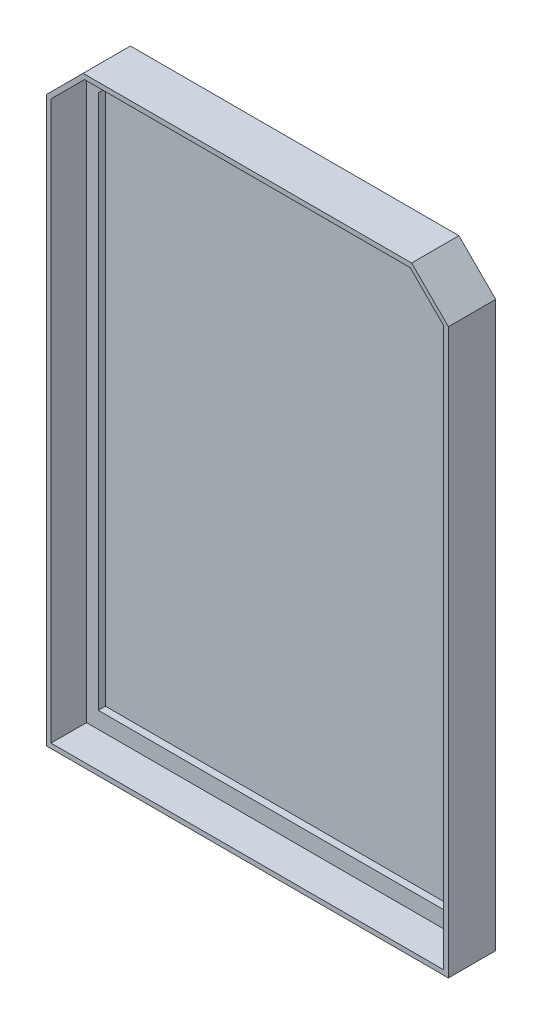
ISO-10303-21;
HEADER;
FILE_DESCRIPTION(('STEP AP214'),'2;1');
FILE_NAME('part.step','',(''),(''),'','','');
FILE_SCHEMA(('AUTOMOTIVE_DESIGN { 1 0 10303 214 1 1 1 1 }'));
ENDSEC;
DATA;
#1=APPLICATION_CONTEXT('core data for automotive mechanical design processes');
#2=APPLICATION_PROTOCOL_DEFINITION('international standard','automotive_design',2000,#1);
#3=PRODUCT_CONTEXT('',#1,'mechanical');
#4=PRODUCT('Part','Part','',(#3));
#5=PRODUCT_RELATED_PRODUCT_CATEGORY('part','',(#4));
#6=PRODUCT_DEFINITION_FORMATION('','',#4);
#7=PRODUCT_DEFINITION_CONTEXT('part definition',#1,'design');
#8=PRODUCT_DEFINITION('design','',#6,#7);
#9=PRODUCT_DEFINITION_SHAPE('','',#8);
#10=(LENGTH_UNIT() NAMED_UNIT(*) SI_UNIT(.MILLI.,.METRE.));
#11=(NAMED_UNIT(*) PLANE_ANGLE_UNIT() SI_UNIT($,.RADIAN.));
#12=(NAMED_UNIT(*) SI_UNIT($,.STERADIAN.) SOLID_ANGLE_UNIT());
#13=UNCERTAINTY_MEASURE_WITH_UNIT(LENGTH_MEASURE(1.E-05),#10,'distance_accuracy_value','');
#14=(GEOMETRIC_REPRESENTATION_CONTEXT(3) GLOBAL_UNCERTAINTY_ASSIGNED_CONTEXT((#13)) GLOBAL_UNIT_ASSIGNED_CONTEXT((#10,
#11,#12)) REPRESENTATION_CONTEXT('',''));
#15=CARTESIAN_POINT('',(0.,0.,0.));
#16=DIRECTION('',(0.,0.,1.));
#17=DIRECTION('',(1.,0.,0.));
#18=AXIS2_PLACEMENT_3D('',#15,#16,#17);
#19=CARTESIAN_POINT('',(46.5251262658473,46.5251262658468,1.5));
#20=DIRECTION('',(0.707106781186551,0.707106781186544,0.));
#21=DIRECTION('',(-0.707106781186544,0.707106781186551,0.));
#22=AXIS2_PLACEMENT_3D('',#19,#20,#21);
#23=PLANE('',#22);
#24=DIRECTION('',(0.707106781186544,-0.707106781186551,0.));
#25=VECTOR('',#24,1.);
#26=CARTESIAN_POINT('',(46.5251262658473,46.5251262658468,0.));
#27=LINE('',#26,#25);
#28=CARTESIAN_POINT('',(34.0502525316942,59.,0.));
#29=VERTEX_POINT('',#28);
#30=CARTESIAN_POINT('',(39.,54.0502525316942,0.));
#31=VERTEX_POINT('',#30);
#32=EDGE_CURVE('E171',#29,#31,#27,.T.);
#33=ORIENTED_EDGE('',*,*,#32,.T.);
#34=DIRECTION('',(0.,0.,-1.));
#35=VECTOR('',#34,1.);
#36=CARTESIAN_POINT('',(39.,54.0502525316942,1.5));
#37=LINE('',#36,#35);
#38=CARTESIAN_POINT('',(39.,54.0502525316942,1.5));
#39=VERTEX_POINT('',#38);
#40=EDGE_CURVE('E318',#39,#31,#37,.T.);
#41=ORIENTED_EDGE('',*,*,#40,.F.);
#42=DIRECTION('',(0.707106781186544,-0.707106781186551,0.));
#43=VECTOR('',#42,1.);
#44=CARTESIAN_POINT('',(46.5251262658473,46.5251262658468,1.5));
#45=LINE('',#44,#43);
#46=CARTESIAN_POINT('',(34.0502525316942,59.,1.5));
#47=VERTEX_POINT('',#46);
#48=EDGE_CURVE('E259',#47,#39,#45,.T.);
#49=ORIENTED_EDGE('',*,*,#48,.F.);
#50=DIRECTION('',(0.,0.,-1.));
#51=VECTOR('',#50,1.);
#52=CARTESIAN_POINT('',(34.0502525316942,59.,1.5));
#53=LINE('',#52,#51);
#54=EDGE_CURVE('E288',#47,#29,#53,.T.);
#55=ORIENTED_EDGE('',*,*,#54,.T.);
#56=EDGE_LOOP('',(#33,#41,#49,#55));
#57=FACE_BOUND('',#56,.T.);
#58=ADVANCED_FACE('F41',(#57),#23,.F.);
#59=CARTESIAN_POINT('',(39.,0.,1.5));
#60=DIRECTION('',(1.,0.,0.));
#61=DIRECTION('',(0.,0.,-1.));
#62=AXIS2_PLACEMENT_3D('',#59,#60,#61);
#63=PLANE('',#62);
#64=DIRECTION('',(0.,-1.,0.));
#65=VECTOR('',#64,1.);
#66=CARTESIAN_POINT('',(39.,0.,0.));
#67=LINE('',#66,#65);
#68=CARTESIAN_POINT('',(39.,-59.,0.));
#69=VERTEX_POINT('',#68);
#70=EDGE_CURVE('E291',#31,#69,#67,.T.);
#71=ORIENTED_EDGE('',*,*,#70,.T.);
#72=DIRECTION('',(0.,0.,-1.));
#73=VECTOR('',#72,1.);
#74=CARTESIAN_POINT('',(39.,-59.,1.5));
#75=LINE('',#74,#73);
#76=CARTESIAN_POINT('',(39.,-59.,1.5));
#77=VERTEX_POINT('',#76);
#78=EDGE_CURVE('E315',#77,#69,#75,.T.);
#79=ORIENTED_EDGE('',*,*,#78,.F.);
#80=DIRECTION('',(0.,-1.,0.));
#81=VECTOR('',#80,1.);
#82=CARTESIAN_POINT('',(39.,0.,1.5));
#83=LINE('',#82,#81);
#84=EDGE_CURVE('E262',#39,#77,#83,.T.);
#85=ORIENTED_EDGE('',*,*,#84,.F.);
#86=ORIENTED_EDGE('',*,*,#40,.T.);
#87=EDGE_LOOP('',(#71,#79,#85,#86));
#88=FACE_BOUND('',#87,.T.);
#89=ADVANCED_FACE('F338',(#88),#63,.F.);
#90=CARTESIAN_POINT('',(0.,-59.,1.5));
#91=DIRECTION('',(0.,-1.,0.));
#92=DIRECTION('',(0.,0.,-1.));
#93=AXIS2_PLACEMENT_3D('',#90,#91,#92);
#94=PLANE('',#93);
#95=DIRECTION('',(-1.,0.,0.));
#96=VECTOR('',#95,1.);
#97=CARTESIAN_POINT('',(0.,-59.,0.));
#98=LINE('',#97,#96);
#99=CARTESIAN_POINT('',(-39.,-59.,0.));
#100=VERTEX_POINT('',#99);
#101=EDGE_CURVE('E294',#69,#100,#98,.T.);
#102=ORIENTED_EDGE('',*,*,#101,.T.);
#103=DIRECTION('',(0.,0.,-1.));
#104=VECTOR('',#103,1.);
#105=CARTESIAN_POINT('',(-39.,-59.,1.5));
#106=LINE('',#105,#104);
#107=CARTESIAN_POINT('',(-39.,-59.,1.5));
#108=VERTEX_POINT('',#107);
#109=EDGE_CURVE('E312',#108,#100,#106,.T.);
#110=ORIENTED_EDGE('',*,*,#109,.F.);
#111=DIRECTION('',(-1.,0.,0.));
#112=VECTOR('',#111,1.);
#113=CARTESIAN_POINT('',(0.,-59.,1.5));
#114=LINE('',#113,#112);
#115=EDGE_CURVE('E265',#77,#108,#114,.T.);
#116=ORIENTED_EDGE('',*,*,#115,.F.);
#117=ORIENTED_EDGE('',*,*,#78,.T.);
#118=EDGE_LOOP('',(#102,#110,#116,#117));
#119=FACE_BOUND('',#118,.T.);
#120=ADVANCED_FACE('F344',(#119),#94,.F.);
#121=CARTESIAN_POINT('',(-39.,0.,1.5));
#122=DIRECTION('',(-1.,0.,0.));
#123=DIRECTION('',(0.,0.,1.));
#124=AXIS2_PLACEMENT_3D('',#121,#122,#123);
#125=PLANE('',#124);
#126=DIRECTION('',(0.,1.,0.));
#127=VECTOR('',#126,1.);
#128=CARTESIAN_POINT('',(-39.,0.,0.));
#129=LINE('',#128,#127);
#130=CARTESIAN_POINT('',(-39.,54.0502525316942,0.));
#131=VERTEX_POINT('',#130);
#132=EDGE_CURVE('E297',#100,#131,#129,.T.);
#133=ORIENTED_EDGE('',*,*,#132,.T.);
#134=DIRECTION('',(0.,0.,-1.));
#135=VECTOR('',#134,1.);
#136=CARTESIAN_POINT('',(-39.,54.0502525316942,1.5));
#137=LINE('',#136,#135);
#138=CARTESIAN_POINT('',(-39.,54.0502525316942,1.5));
#139=VERTEX_POINT('',#138);
#140=EDGE_CURVE('E309',#139,#131,#137,.T.);
#141=ORIENTED_EDGE('',*,*,#140,.F.);
#142=DIRECTION('',(0.,1.,0.));
#143=VECTOR('',#142,1.);
#144=CARTESIAN_POINT('',(-39.,0.,1.5));
#145=LINE('',#144,#143);
#146=EDGE_CURVE('E267',#108,#139,#145,.T.);
#147=ORIENTED_EDGE('',*,*,#146,.F.);
#148=ORIENTED_EDGE('',*,*,#109,.T.);
#149=EDGE_LOOP('',(#133,#141,#147,#148));
#150=FACE_BOUND('',#149,.T.);
#151=ADVANCED_FACE('F350',(#150),#125,.F.);
#152=CARTESIAN_POINT('',(-46.5251262658471,46.5251262658471,1.5));
#153=DIRECTION('',(-0.707106781186547,0.707106781186548,0.));
#154=DIRECTION('',(-0.707106781186548,-0.707106781186547,0.));
#155=AXIS2_PLACEMENT_3D('',#152,#153,#154);
#156=PLANE('',#155);
#157=DIRECTION('',(0.707106781186548,0.707106781186547,0.));
#158=VECTOR('',#157,1.);
#159=CARTESIAN_POINT('',(-46.5251262658471,46.5251262658471,0.));
#160=LINE('',#159,#158);
#161=CARTESIAN_POINT('',(-34.0502525316942,59.,0.));
#162=VERTEX_POINT('',#161);
#163=EDGE_CURVE('E300',#131,#162,#160,.T.);
#164=ORIENTED_EDGE('',*,*,#163,.T.);
#165=DIRECTION('',(0.,0.,-1.));
#166=VECTOR('',#165,1.);
#167=CARTESIAN_POINT('',(-34.0502525316942,59.,1.5));
#168=LINE('',#167,#166);
#169=CARTESIAN_POINT('',(-34.0502525316942,59.,1.5));
#170=VERTEX_POINT('',#169);
#171=EDGE_CURVE('E306',#170,#162,#168,.T.);
#172=ORIENTED_EDGE('',*,*,#171,.F.);
#173=DIRECTION('',(0.707106781186548,0.707106781186547,0.));
#174=VECTOR('',#173,1.);
#175=CARTESIAN_POINT('',(-46.5251262658471,46.5251262658471,1.5));
#176=LINE('',#175,#174);
#177=EDGE_CURVE('E269',#139,#170,#176,.T.);
#178=ORIENTED_EDGE('',*,*,#177,.F.);
#179=ORIENTED_EDGE('',*,*,#140,.T.);
#180=EDGE_LOOP('',(#164,#172,#178,#179));
#181=FACE_BOUND('',#180,.T.);
#182=ADVANCED_FACE('F354',(#181),#156,.F.);
#183=CARTESIAN_POINT('',(0.,59.,1.5));
#184=DIRECTION('',(0.,-1.,0.));
#185=DIRECTION('',(1.,0.,0.));
#186=AXIS2_PLACEMENT_3D('',#183,#184,#185);
#187=PLANE('',#186);
#188=DIRECTION('',(-1.,0.,0.));
#189=VECTOR('',#188,1.);
#190=CARTESIAN_POINT('',(0.,59.,0.));
#191=LINE('',#190,#189);
#192=EDGE_CURVE('E263',#29,#162,#191,.T.);
#193=ORIENTED_EDGE('',*,*,#192,.F.);
#194=ORIENTED_EDGE('',*,*,#54,.F.);
#195=DIRECTION('',(-1.,0.,0.));
#196=VECTOR('',#195,1.);
#197=CARTESIAN_POINT('',(0.,59.,1.5));
#198=LINE('',#197,#196);
#199=EDGE_CURVE('E271',#47,#170,#198,.T.);
#200=ORIENTED_EDGE('',*,*,#199,.T.);
#201=ORIENTED_EDGE('',*,*,#171,.T.);
#202=EDGE_LOOP('',(#193,#194,#200,#201));
#203=FACE_BOUND('',#202,.T.);
#204=ADVANCED_FACE('F358',(#203),#187,.T.);
#205=CARTESIAN_POINT('',(0.,0.,1.5));
#206=DIRECTION('',(0.,0.,1.));
#207=DIRECTION('',(1.,0.,0.));
#208=AXIS2_PLACEMENT_3D('',#205,#206,#207);
#209=PLANE('',#208);
#210=ORIENTED_EDGE('',*,*,#48,.T.);
#211=ORIENTED_EDGE('',*,*,#84,.T.);
#212=ORIENTED_EDGE('',*,*,#115,.T.);
#213=ORIENTED_EDGE('',*,*,#146,.T.);
#214=ORIENTED_EDGE('',*,*,#177,.T.);
#215=ORIENTED_EDGE('',*,*,#199,.F.);
#216=EDGE_LOOP('',(#210,#211,#212,#213,#214,#215));
#217=FACE_BOUND('',#216,.T.);
#218=DIRECTION('',(0.707106781186548,0.707106781186547,0.));
#219=VECTOR('',#218,1.);
#220=CARTESIAN_POINT('',(-48.4644660940673,48.4644660940673,1.5));
#221=LINE('',#220,#219);
#222=CARTESIAN_POINT('',(-41.5,55.4289321881345,1.5));
#223=VERTEX_POINT('',#222);
#224=CARTESIAN_POINT('',(-34.4289321881345,62.5,1.5));
#225=VERTEX_POINT('',#224);
#226=EDGE_CURVE('E274',#223,#225,#221,.T.);
#227=ORIENTED_EDGE('',*,*,#226,.F.);
#228=DIRECTION('',(0.,-1.,0.));
#229=VECTOR('',#228,1.);
#230=CARTESIAN_POINT('',(-41.5,0.,1.5));
#231=LINE('',#230,#229);
#232=CARTESIAN_POINT('',(-41.5,-62.5,1.5));
#233=VERTEX_POINT('',#232);
#234=EDGE_CURVE('E276',#223,#233,#231,.T.);
#235=ORIENTED_EDGE('',*,*,#234,.T.);
#236=DIRECTION('',(-1.,0.,0.));
#237=VECTOR('',#236,1.);
#238=CARTESIAN_POINT('',(0.,-62.5,1.5));
#239=LINE('',#238,#237);
#240=CARTESIAN_POINT('',(41.5,-62.5,1.5));
#241=VERTEX_POINT('',#240);
#242=EDGE_CURVE('E278',#241,#233,#239,.T.);
#243=ORIENTED_EDGE('',*,*,#242,.F.);
#244=DIRECTION('',(0.,-1.,0.));
#245=VECTOR('',#244,1.);
#246=CARTESIAN_POINT('',(41.5,0.,1.5));
#247=LINE('',#246,#245);
#248=CARTESIAN_POINT('',(41.5,55.4289321881345,1.5));
#249=VERTEX_POINT('',#248);
#250=EDGE_CURVE('E281',#249,#241,#247,.T.);
#251=ORIENTED_EDGE('',*,*,#250,.F.);
#252=DIRECTION('',(0.707106781186546,-0.707106781186549,0.));
#253=VECTOR('',#252,1.);
#254=CARTESIAN_POINT('',(48.4644660940673,48.4644660940672,1.5));
#255=LINE('',#254,#253);
#256=CARTESIAN_POINT('',(34.4289321881345,62.5,1.5));
#257=VERTEX_POINT('',#256);
#258=EDGE_CURVE('E284',#257,#249,#255,.T.);
#259=ORIENTED_EDGE('',*,*,#258,.F.);
#260=DIRECTION('',(-1.,0.,0.));
#261=VECTOR('',#260,1.);
#262=CARTESIAN_POINT('',(0.,62.5,1.5));
#263=LINE('',#262,#261);
#264=EDGE_CURVE('E57',#257,#225,#263,.T.);
#265=ORIENTED_EDGE('',*,*,#264,.T.);
#266=EDGE_LOOP('',(#227,#235,#243,#251,#259,#265));
#267=FACE_BOUND('',#266,.T.);
#268=ADVANCED_FACE('F362',(#217,#267),#209,.T.);
#269=CARTESIAN_POINT('',(0.,-63.5,9.));
#270=DIRECTION('',(0.,1.,0.));
#271=DIRECTION('',(0.,0.,1.));
#272=AXIS2_PLACEMENT_3D('',#269,#270,#271);
#273=PLANE('',#272);
#274=DIRECTION('',(0.,0.,-1.));
#275=VECTOR('',#274,1.);
#276=CARTESIAN_POINT('',(-42.5,-63.5,9.));
#277=LINE('',#276,#275);
#278=CARTESIAN_POINT('',(-42.5,-63.5,9.));
#279=VERTEX_POINT('',#278);
#280=CARTESIAN_POINT('',(-42.5,-63.5,-1.));
#281=VERTEX_POINT('',#280);
#282=EDGE_CURVE('E187',#279,#281,#277,.T.);
#283=ORIENTED_EDGE('',*,*,#282,.T.);
#284=DIRECTION('',(1.,0.,0.));
#285=VECTOR('',#284,1.);
#286=CARTESIAN_POINT('',(0.,-63.5,-1.));
#287=LINE('',#286,#285);
#288=CARTESIAN_POINT('',(42.5,-63.5,-1.));
#289=VERTEX_POINT('',#288);
#290=EDGE_CURVE('E179',#281,#289,#287,.T.);
#291=ORIENTED_EDGE('',*,*,#290,.T.);
#292=DIRECTION('',(0.,0.,-1.));
#293=VECTOR('',#292,1.);
#294=CARTESIAN_POINT('',(42.5,-63.5,9.));
#295=LINE('',#294,#293);
#296=CARTESIAN_POINT('',(42.5,-63.5,9.));
#297=VERTEX_POINT('',#296);
#298=EDGE_CURVE('E161',#297,#289,#295,.T.);
#299=ORIENTED_EDGE('',*,*,#298,.F.);
#300=DIRECTION('',(1.,0.,0.));
#301=VECTOR('',#300,1.);
#302=CARTESIAN_POINT('',(0.,-63.5,9.));
#303=LINE('',#302,#301);
#304=EDGE_CURVE('E222',#279,#297,#303,.T.);
#305=ORIENTED_EDGE('',*,*,#304,.F.);
#306=EDGE_LOOP('',(#283,#291,#299,#305));
#307=FACE_BOUND('',#306,.T.);
#308=ADVANCED_FACE('F185',(#307),#273,.F.);
#309=CARTESIAN_POINT('',(42.5,0.,9.));
#310=DIRECTION('',(-1.,0.,0.));
#311=DIRECTION('',(0.,-1.,0.));
#312=AXIS2_PLACEMENT_3D('',#309,#310,#311);
#313=PLANE('',#312);
#314=ORIENTED_EDGE('',*,*,#298,.T.);
#315=DIRECTION('',(0.,1.,0.));
#316=VECTOR('',#315,1.);
#317=CARTESIAN_POINT('',(42.5,0.,-1.));
#318=LINE('',#317,#316);
#319=CARTESIAN_POINT('',(42.5,55.721825406948,-1.));
#320=VERTEX_POINT('',#319);
#321=EDGE_CURVE('E165',#289,#320,#318,.T.);
#322=ORIENTED_EDGE('',*,*,#321,.T.);
#323=DIRECTION('',(0.,0.,-1.));
#324=VECTOR('',#323,1.);
#325=CARTESIAN_POINT('',(42.5,55.721825406948,9.));
#326=LINE('',#325,#324);
#327=CARTESIAN_POINT('',(42.5,55.721825406948,9.));
#328=VERTEX_POINT('',#327);
#329=EDGE_CURVE('E172',#328,#320,#326,.T.);
#330=ORIENTED_EDGE('',*,*,#329,.F.);
#331=DIRECTION('',(0.,1.,0.));
#332=VECTOR('',#331,1.);
#333=CARTESIAN_POINT('',(42.5,0.,9.));
#334=LINE('',#333,#332);
#335=EDGE_CURVE('E166',#297,#328,#334,.T.);
#336=ORIENTED_EDGE('',*,*,#335,.F.);
#337=EDGE_LOOP('',(#314,#322,#330,#336));
#338=FACE_BOUND('',#337,.T.);
#339=ADVANCED_FACE('F163',(#338),#313,.F.);
#340=CARTESIAN_POINT('',(49.110912703474,49.1109127034739,9.));
#341=DIRECTION('',(-0.707106781186548,-0.707106781186547,0.));
#342=DIRECTION('',(0.707106781186547,-0.707106781186548,0.));
#343=AXIS2_PLACEMENT_3D('',#340,#341,#342);
#344=PLANE('',#343);
#345=ORIENTED_EDGE('',*,*,#329,.T.);
#346=DIRECTION('',(-0.707106781186547,0.707106781186548,0.));
#347=VECTOR('',#346,1.);
#348=CARTESIAN_POINT('',(49.110912703474,49.1109127034739,-1.));
#349=LINE('',#348,#347);
#350=CARTESIAN_POINT('',(34.721825406948,63.5,-1.));
#351=VERTEX_POINT('',#350);
#352=EDGE_CURVE('E183',#320,#351,#349,.T.);
#353=ORIENTED_EDGE('',*,*,#352,.T.);
#354=DIRECTION('',(0.,0.,-1.));
#355=VECTOR('',#354,1.);
#356=CARTESIAN_POINT('',(34.721825406948,63.5,9.));
#357=LINE('',#356,#355);
#358=CARTESIAN_POINT('',(34.721825406948,63.5,9.));
#359=VERTEX_POINT('',#358);
#360=EDGE_CURVE('E240',#359,#351,#357,.T.);
#361=ORIENTED_EDGE('',*,*,#360,.F.);
#362=DIRECTION('',(-0.707106781186547,0.707106781186548,0.));
#363=VECTOR('',#362,1.);
#364=CARTESIAN_POINT('',(49.110912703474,49.1109127034739,9.));
#365=LINE('',#364,#363);
#366=EDGE_CURVE('E225',#328,#359,#365,.T.);
#367=ORIENTED_EDGE('',*,*,#366,.F.);
#368=EDGE_LOOP('',(#345,#353,#361,#367));
#369=FACE_BOUND('',#368,.T.);
#370=ADVANCED_FACE('F397',(#369),#344,.F.);
#371=CARTESIAN_POINT('',(0.,63.5,9.));
#372=DIRECTION('',(0.,-1.,0.));
#373=DIRECTION('',(0.,0.,-1.));
#374=AXIS2_PLACEMENT_3D('',#371,#372,#373);
#375=PLANE('',#374);
#376=ORIENTED_EDGE('',*,*,#360,.T.);
#377=DIRECTION('',(-1.,0.,0.));
#378=VECTOR('',#377,1.);
#379=CARTESIAN_POINT('',(0.,63.5,-1.));
#380=LINE('',#379,#378);
#381=CARTESIAN_POINT('',(-34.721825406948,63.5,-1.));
#382=VERTEX_POINT('',#381);
#383=EDGE_CURVE('E196',#351,#382,#380,.T.);
#384=ORIENTED_EDGE('',*,*,#383,.T.);
#385=DIRECTION('',(0.,0.,-1.));
#386=VECTOR('',#385,1.);
#387=CARTESIAN_POINT('',(-34.721825406948,63.5,9.));
#388=LINE('',#387,#386);
#389=CARTESIAN_POINT('',(-34.721825406948,63.5,9.));
#390=VERTEX_POINT('',#389);
#391=EDGE_CURVE('E238',#390,#382,#388,.T.);
#392=ORIENTED_EDGE('',*,*,#391,.F.);
#393=DIRECTION('',(-1.,0.,0.));
#394=VECTOR('',#393,1.);
#395=CARTESIAN_POINT('',(0.,63.5,9.));
#396=LINE('',#395,#394);
#397=EDGE_CURVE('E227',#359,#390,#396,.T.);
#398=ORIENTED_EDGE('',*,*,#397,.F.);
#399=EDGE_LOOP('',(#376,#384,#392,#398));
#400=FACE_BOUND('',#399,.T.);
#401=ADVANCED_FACE('F400',(#400),#375,.F.);
#402=CARTESIAN_POINT('',(-49.1109127034739,49.1109127034741,9.));
#403=DIRECTION('',(0.707106781186546,-0.707106781186549,0.));
#404=DIRECTION('',(0.707106781186549,0.707106781186546,0.));
#405=AXIS2_PLACEMENT_3D('',#402,#403,#404);
#406=PLANE('',#405);
#407=ORIENTED_EDGE('',*,*,#391,.T.);
#408=DIRECTION('',(-0.707106781186549,-0.707106781186546,0.));
#409=VECTOR('',#408,1.);
#410=CARTESIAN_POINT('',(-49.1109127034739,49.1109127034741,-1.));
#411=LINE('',#410,#409);
#412=CARTESIAN_POINT('',(-42.5,55.721825406948,-1.));
#413=VERTEX_POINT('',#412);
#414=EDGE_CURVE('E199',#382,#413,#411,.T.);
#415=ORIENTED_EDGE('',*,*,#414,.T.);
#416=DIRECTION('',(0.,0.,-1.));
#417=VECTOR('',#416,1.);
#418=CARTESIAN_POINT('',(-42.5,55.721825406948,9.));
#419=LINE('',#418,#417);
#420=CARTESIAN_POINT('',(-42.5,55.721825406948,9.));
#421=VERTEX_POINT('',#420);
#422=EDGE_CURVE('E235',#421,#413,#419,.T.);
#423=ORIENTED_EDGE('',*,*,#422,.F.);
#424=DIRECTION('',(-0.707106781186549,-0.707106781186546,0.));
#425=VECTOR('',#424,1.);
#426=CARTESIAN_POINT('',(-49.1109127034739,49.1109127034741,9.));
#427=LINE('',#426,#425);
#428=EDGE_CURVE('E229',#390,#421,#427,.T.);
#429=ORIENTED_EDGE('',*,*,#428,.F.);
#430=EDGE_LOOP('',(#407,#415,#423,#429));
#431=FACE_BOUND('',#430,.T.);
#432=ADVANCED_FACE('F371',(#431),#406,.F.);
#433=CARTESIAN_POINT('',(41.5,0.,9.));
#434=DIRECTION('',(-1.,0.,0.));
#435=DIRECTION('',(0.,-1.,0.));
#436=AXIS2_PLACEMENT_3D('',#433,#434,#435);
#437=PLANE('',#436);
#438=DIRECTION('',(0.,0.,-1.));
#439=VECTOR('',#438,1.);
#440=CARTESIAN_POINT('',(41.5,55.4289321881345,9.));
#441=LINE('',#440,#439);
#442=CARTESIAN_POINT('',(41.5,55.4289321881345,9.));
#443=VERTEX_POINT('',#442);
#444=EDGE_CURVE('E233',#443,#249,#441,.T.);
#445=ORIENTED_EDGE('',*,*,#444,.T.);
#446=ORIENTED_EDGE('',*,*,#250,.T.);
#447=DIRECTION('',(0.,0.,-1.));
#448=VECTOR('',#447,1.);
#449=CARTESIAN_POINT('',(41.5,-62.5,9.));
#450=LINE('',#449,#448);
#451=CARTESIAN_POINT('',(41.5,-62.5,9.));
#452=VERTEX_POINT('',#451);
#453=EDGE_CURVE('E236',#452,#241,#450,.T.);
#454=ORIENTED_EDGE('',*,*,#453,.F.);
#455=DIRECTION('',(0.,1.,0.));
#456=VECTOR('',#455,1.);
#457=CARTESIAN_POINT('',(41.5,0.,9.));
#458=LINE('',#457,#456);
#459=EDGE_CURVE('E204',#452,#443,#458,.T.);
#460=ORIENTED_EDGE('',*,*,#459,.T.);
#461=EDGE_LOOP('',(#445,#446,#454,#460));
#462=FACE_BOUND('',#461,.T.);
#463=ADVANCED_FACE('F367',(#462),#437,.T.);
#464=CARTESIAN_POINT('',(0.,-62.5,9.));
#465=DIRECTION('',(0.,1.,0.));
#466=DIRECTION('',(0.,0.,1.));
#467=AXIS2_PLACEMENT_3D('',#464,#465,#466);
#468=PLANE('',#467);
#469=ORIENTED_EDGE('',*,*,#453,.T.);
#470=ORIENTED_EDGE('',*,*,#242,.T.);
#471=DIRECTION('',(0.,0.,-1.));
#472=VECTOR('',#471,1.);
#473=CARTESIAN_POINT('',(-41.5,-62.5,9.));
#474=LINE('',#473,#472);
#475=CARTESIAN_POINT('',(-41.5,-62.5,9.));
#476=VERTEX_POINT('',#475);
#477=EDGE_CURVE('E254',#476,#233,#474,.T.);
#478=ORIENTED_EDGE('',*,*,#477,.F.);
#479=DIRECTION('',(1.,0.,0.));
#480=VECTOR('',#479,1.);
#481=CARTESIAN_POINT('',(0.,-62.5,9.));
#482=LINE('',#481,#480);
#483=EDGE_CURVE('E207',#476,#452,#482,.T.);
#484=ORIENTED_EDGE('',*,*,#483,.T.);
#485=EDGE_LOOP('',(#469,#470,#478,#484));
#486=FACE_BOUND('',#485,.T.);
#487=ADVANCED_FACE('F370',(#486),#468,.T.);
#488=CARTESIAN_POINT('',(-41.5,0.,9.));
#489=DIRECTION('',(1.,0.,0.));
#490=DIRECTION('',(0.,1.,0.));
#491=AXIS2_PLACEMENT_3D('',#488,#489,#490);
#492=PLANE('',#491);
#493=ORIENTED_EDGE('',*,*,#477,.T.);
#494=ORIENTED_EDGE('',*,*,#234,.F.);
#495=DIRECTION('',(0.,0.,-1.));
#496=VECTOR('',#495,1.);
#497=CARTESIAN_POINT('',(-41.5,55.4289321881345,9.));
#498=LINE('',#497,#496);
#499=CARTESIAN_POINT('',(-41.5,55.4289321881345,9.));
#500=VERTEX_POINT('',#499);
#501=EDGE_CURVE('E251',#500,#223,#498,.T.);
#502=ORIENTED_EDGE('',*,*,#501,.F.);
#503=DIRECTION('',(0.,-1.,0.));
#504=VECTOR('',#503,1.);
#505=CARTESIAN_POINT('',(-41.5,0.,9.));
#506=LINE('',#505,#504);
#507=EDGE_CURVE('E210',#500,#476,#506,.T.);
#508=ORIENTED_EDGE('',*,*,#507,.T.);
#509=EDGE_LOOP('',(#493,#494,#502,#508));
#510=FACE_BOUND('',#509,.T.);
#511=ADVANCED_FACE('F375',(#510),#492,.T.);
#512=CARTESIAN_POINT('',(-48.4644660940673,48.4644660940673,9.));
#513=DIRECTION('',(0.707106781186547,-0.707106781186548,0.));
#514=DIRECTION('',(0.707106781186548,0.707106781186547,0.));
#515=AXIS2_PLACEMENT_3D('',#512,#513,#514);
#516=PLANE('',#515);
#517=ORIENTED_EDGE('',*,*,#501,.T.);
#518=ORIENTED_EDGE('',*,*,#226,.T.);
#519=DIRECTION('',(0.,0.,-1.));
#520=VECTOR('',#519,1.);
#521=CARTESIAN_POINT('',(-34.4289321881345,62.5,9.));
#522=LINE('',#521,#520);
#523=CARTESIAN_POINT('',(-34.4289321881345,62.5,9.));
#524=VERTEX_POINT('',#523);
#525=EDGE_CURVE('E248',#524,#225,#522,.T.);
#526=ORIENTED_EDGE('',*,*,#525,.F.);
#527=DIRECTION('',(-0.707106781186548,-0.707106781186547,0.));
#528=VECTOR('',#527,1.);
#529=CARTESIAN_POINT('',(-48.4644660940673,48.4644660940673,9.));
#530=LINE('',#529,#528);
#531=EDGE_CURVE('E213',#524,#500,#530,.T.);
#532=ORIENTED_EDGE('',*,*,#531,.T.);
#533=EDGE_LOOP('',(#517,#518,#526,#532));
#534=FACE_BOUND('',#533,.T.);
#535=ADVANCED_FACE('F379',(#534),#516,.T.);
#536=CARTESIAN_POINT('',(0.,62.5,9.));
#537=DIRECTION('',(0.,-1.,0.));
#538=DIRECTION('',(0.,0.,-1.));
#539=AXIS2_PLACEMENT_3D('',#536,#537,#538);
#540=PLANE('',#539);
#541=ORIENTED_EDGE('',*,*,#525,.T.);
#542=ORIENTED_EDGE('',*,*,#264,.F.);
#543=DIRECTION('',(0.,0.,-1.));
#544=VECTOR('',#543,1.);
#545=CARTESIAN_POINT('',(34.4289321881345,62.5,9.));
#546=LINE('',#545,#544);
#547=CARTESIAN_POINT('',(34.4289321881345,62.5,9.));
#548=VERTEX_POINT('',#547);
#549=EDGE_CURVE('E245',#548,#257,#546,.T.);
#550=ORIENTED_EDGE('',*,*,#549,.F.);
#551=DIRECTION('',(-1.,0.,0.));
#552=VECTOR('',#551,1.);
#553=CARTESIAN_POINT('',(0.,62.5,9.));
#554=LINE('',#553,#552);
#555=EDGE_CURVE('E216',#548,#524,#554,.T.);
#556=ORIENTED_EDGE('',*,*,#555,.T.);
#557=EDGE_LOOP('',(#541,#542,#550,#556));
#558=FACE_BOUND('',#557,.T.);
#559=ADVANCED_FACE('F383',(#558),#540,.T.);
#560=CARTESIAN_POINT('',(48.4644660940673,48.4644660940672,9.));
#561=DIRECTION('',(-0.707106781186548,-0.707106781186546,0.));
#562=DIRECTION('',(0.707106781186546,-0.707106781186549,0.));
#563=AXIS2_PLACEMENT_3D('',#560,#561,#562);
#564=PLANE('',#563);
#565=ORIENTED_EDGE('',*,*,#549,.T.);
#566=ORIENTED_EDGE('',*,*,#258,.T.);
#567=ORIENTED_EDGE('',*,*,#444,.F.);
#568=DIRECTION('',(-0.707106781186546,0.707106781186549,0.));
#569=VECTOR('',#568,1.);
#570=CARTESIAN_POINT('',(48.4644660940673,48.4644660940672,9.));
#571=LINE('',#570,#569);
#572=EDGE_CURVE('E219',#443,#548,#571,.T.);
#573=ORIENTED_EDGE('',*,*,#572,.T.);
#574=EDGE_LOOP('',(#565,#566,#567,#573));
#575=FACE_BOUND('',#574,.T.);
#576=ADVANCED_FACE('F387',(#575),#564,.T.);
#577=CARTESIAN_POINT('',(-42.5,0.,9.));
#578=DIRECTION('',(1.,0.,0.));
#579=DIRECTION('',(0.,1.,0.));
#580=AXIS2_PLACEMENT_3D('',#577,#578,#579);
#581=PLANE('',#580);
#582=ORIENTED_EDGE('',*,*,#422,.T.);
#583=DIRECTION('',(0.,-1.,0.));
#584=VECTOR('',#583,1.);
#585=CARTESIAN_POINT('',(-42.5,0.,-1.));
#586=LINE('',#585,#584);
#587=EDGE_CURVE('E202',#413,#281,#586,.T.);
#588=ORIENTED_EDGE('',*,*,#587,.T.);
#589=ORIENTED_EDGE('',*,*,#282,.F.);
#590=DIRECTION('',(0.,-1.,0.));
#591=VECTOR('',#590,1.);
#592=CARTESIAN_POINT('',(-42.5,0.,9.));
#593=LINE('',#592,#591);
#594=EDGE_CURVE('E231',#421,#279,#593,.T.);
#595=ORIENTED_EDGE('',*,*,#594,.F.);
#596=EDGE_LOOP('',(#582,#588,#589,#595));
#597=FACE_BOUND('',#596,.T.);
#598=ADVANCED_FACE('F391',(#597),#581,.F.);
#599=CARTESIAN_POINT('',(0.,0.,9.));
#600=DIRECTION('',(0.,0.,1.));
#601=DIRECTION('',(1.,0.,0.));
#602=AXIS2_PLACEMENT_3D('',#599,#600,#601);
#603=PLANE('',#602);
#604=ORIENTED_EDGE('',*,*,#459,.F.);
#605=ORIENTED_EDGE('',*,*,#483,.F.);
#606=ORIENTED_EDGE('',*,*,#507,.F.);
#607=ORIENTED_EDGE('',*,*,#531,.F.);
#608=ORIENTED_EDGE('',*,*,#555,.F.);
#609=ORIENTED_EDGE('',*,*,#572,.F.);
#610=EDGE_LOOP('',(#604,#605,#606,#607,#608,#609));
#611=FACE_BOUND('',#610,.T.);
#612=ORIENTED_EDGE('',*,*,#304,.T.);
#613=ORIENTED_EDGE('',*,*,#335,.T.);
#614=ORIENTED_EDGE('',*,*,#366,.T.);
#615=ORIENTED_EDGE('',*,*,#397,.T.);
#616=ORIENTED_EDGE('',*,*,#428,.T.);
#617=ORIENTED_EDGE('',*,*,#594,.T.);
#618=EDGE_LOOP('',(#612,#613,#614,#615,#616,#617));
#619=FACE_BOUND('',#618,.T.);
#620=ADVANCED_FACE('F410',(#611,#619),#603,.T.);
#621=CARTESIAN_POINT('',(0.,0.,0.));
#622=DIRECTION('',(0.,0.,1.));
#623=DIRECTION('',(1.,0.,0.));
#624=AXIS2_PLACEMENT_3D('',#621,#622,#623);
#625=PLANE('',#624);
#626=ORIENTED_EDGE('',*,*,#32,.F.);
#627=ORIENTED_EDGE('',*,*,#192,.T.);
#628=ORIENTED_EDGE('',*,*,#163,.F.);
#629=ORIENTED_EDGE('',*,*,#132,.F.);
#630=ORIENTED_EDGE('',*,*,#101,.F.);
#631=ORIENTED_EDGE('',*,*,#70,.F.);
#632=EDGE_LOOP('',(#626,#627,#628,#629,#630,#631));
#633=FACE_BOUND('',#632,.T.);
#634=ADVANCED_FACE('F413',(#633),#625,.T.);
#635=CARTESIAN_POINT('',(0.,0.,-1.));
#636=DIRECTION('',(0.,0.,1.));
#637=DIRECTION('',(1.,0.,0.));
#638=AXIS2_PLACEMENT_3D('',#635,#636,#637);
#639=PLANE('',#638);
#640=CARTESIAN_POINT('',(0.,0.,-1.));
#641=DIRECTION('',(0.,0.,1.));
#642=DIRECTION('',(1.,0.,0.));
#643=AXIS2_PLACEMENT_3D('',#640,#641,#642);
#644=CIRCLE('',#643,10.);
#645=CARTESIAN_POINT('',(10.,0.,-1.));
#646=VERTEX_POINT('',#645);
#647=EDGE_CURVE('E11',#646,#646,#644,.T.);
#648=ORIENTED_EDGE('',*,*,#647,.T.);
#649=EDGE_LOOP('',(#648));
#650=FACE_BOUND('',#649,.T.);
#651=ORIENTED_EDGE('',*,*,#290,.F.);
#652=ORIENTED_EDGE('',*,*,#587,.F.);
#653=ORIENTED_EDGE('',*,*,#414,.F.);
#654=ORIENTED_EDGE('',*,*,#383,.F.);
#655=ORIENTED_EDGE('',*,*,#352,.F.);
#656=ORIENTED_EDGE('',*,*,#321,.F.);
#657=EDGE_LOOP('',(#651,#652,#653,#654,#655,#656));
#658=FACE_BOUND('',#657,.T.);
#659=ADVANCED_FACE('F177',(#650,#658),#639,.F.);
#660=CARTESIAN_POINT('',(0.,0.,-11.));
#661=DIRECTION('',(0.,0.,-1.));
#662=DIRECTION('',(-1.,0.,0.));
#663=AXIS2_PLACEMENT_3D('',#660,#661,#662);
#664=PLANE('',#663);
#665=CARTESIAN_POINT('',(0.,0.,-11.));
#666=DIRECTION('',(0.,0.,-1.));
#667=DIRECTION('',(-1.,0.,0.));
#668=AXIS2_PLACEMENT_3D('',#665,#666,#667);
#669=CIRCLE('',#668,5.);
#670=CARTESIAN_POINT('',(-5.,0.,-11.));
#671=VERTEX_POINT('',#670);
#672=EDGE_CURVE('E188',#671,#671,#669,.T.);
#673=ORIENTED_EDGE('',*,*,#672,.T.);
#674=EDGE_LOOP('',(#673));
#675=FACE_BOUND('',#674,.T.);
#676=CARTESIAN_POINT('',(0.,0.,-11.));
#677=DIRECTION('',(0.,0.,-1.));
#678=DIRECTION('',(-1.,0.,0.));
#679=AXIS2_PLACEMENT_3D('',#676,#677,#678);
#680=CIRCLE('',#679,4.);
#681=CARTESIAN_POINT('',(-4.,0.,-11.));
#682=VERTEX_POINT('',#681);
#683=EDGE_CURVE('E191',#682,#682,#680,.T.);
#684=ORIENTED_EDGE('',*,*,#683,.F.);
#685=EDGE_LOOP('',(#684));
#686=FACE_BOUND('',#685,.T.);
#687=ADVANCED_FACE('F419',(#675,#686),#664,.T.);
#688=CARTESIAN_POINT('',(0.,0.,-11.));
#689=DIRECTION('',(0.,0.,1.));
#690=DIRECTION('',(1.,0.,0.));
#691=AXIS2_PLACEMENT_3D('',#688,#689,#690);
#692=CYLINDRICAL_SURFACE('',#691,5.);
#693=CARTESIAN_POINT('',(0.,0.,-6.));
#694=DIRECTION('',(0.,0.,1.));
#695=DIRECTION('',(1.,0.,0.));
#696=AXIS2_PLACEMENT_3D('',#693,#694,#695);
#697=CIRCLE('',#696,5.);
#698=CARTESIAN_POINT('',(5.,0.,-6.));
#699=VERTEX_POINT('',#698);
#700=EDGE_CURVE('E50',#699,#699,#697,.F.);
#701=ORIENTED_EDGE('',*,*,#700,.T.);
#702=EDGE_LOOP('',(#701));
#703=FACE_BOUND('',#702,.T.);
#704=ORIENTED_EDGE('',*,*,#672,.F.);
#705=EDGE_LOOP('',(#704));
#706=FACE_BOUND('',#705,.T.);
#707=ADVANCED_FACE('F323',(#703,#706),#692,.T.);
#708=CARTESIAN_POINT('',(0.,0.,-11.));
#709=DIRECTION('',(0.,0.,1.));
#710=DIRECTION('',(1.,0.,0.));
#711=AXIS2_PLACEMENT_3D('',#708,#709,#710);
#712=CYLINDRICAL_SURFACE('',#711,4.);
#713=ORIENTED_EDGE('',*,*,#683,.T.);
#714=EDGE_LOOP('',(#713));
#715=FACE_BOUND('',#714,.T.);
#716=CARTESIAN_POINT('',(0.,0.,-1.));
#717=DIRECTION('',(0.,0.,-1.));
#718=DIRECTION('',(-1.,0.,0.));
#719=AXIS2_PLACEMENT_3D('',#716,#717,#718);
#720=CIRCLE('',#719,4.);
#721=CARTESIAN_POINT('',(-4.,0.,-1.));
#722=VERTEX_POINT('',#721);
#723=EDGE_CURVE('E434',#722,#722,#720,.T.);
#724=ORIENTED_EDGE('',*,*,#723,.F.);
#725=EDGE_LOOP('',(#724));
#726=FACE_BOUND('',#725,.T.);
#727=ADVANCED_FACE('F333',(#715,#726),#712,.F.);
#728=ORIENTED_EDGE('',*,*,#723,.T.);
#729=EDGE_LOOP('',(#728));
#730=FACE_BOUND('',#729,.T.);
#731=ADVANCED_FACE('F327',(#730),#639,.F.);
#732=CARTESIAN_POINT('',(0.,0.,-6.));
#733=DIRECTION('',(0.,0.,1.));
#734=DIRECTION('',(1.,0.,0.));
#735=AXIS2_PLACEMENT_3D('',#732,#733,#734);
#736=TOROIDAL_SURFACE('',#735,10.,5.);
#737=ORIENTED_EDGE('',*,*,#647,.F.);
#738=EDGE_LOOP('',(#737));
#739=FACE_BOUND('',#738,.T.);
#740=ORIENTED_EDGE('',*,*,#700,.F.);
#741=EDGE_LOOP('',(#740));
#742=FACE_BOUND('',#741,.T.);
#743=ADVANCED_FACE('F43',(#739,#742),#736,.F.);
#744=CLOSED_SHELL('',(#58,#89,#120,#151,#182,#204,#268,#308,#339,#370,#401,#432,#463,#487,#511,
#535,#559,#576,#598,#620,#634,#659,#687,#707,#727,#731,#743));
#745=MANIFOLD_SOLID_BREP('B2',#744);
#746=ADVANCED_BREP_SHAPE_REPRESENTATION('',(#18,#745),#14);
#747=SHAPE_DEFINITION_REPRESENTATION(#9,#746);
ENDSEC;
END-ISO-10303-21;
